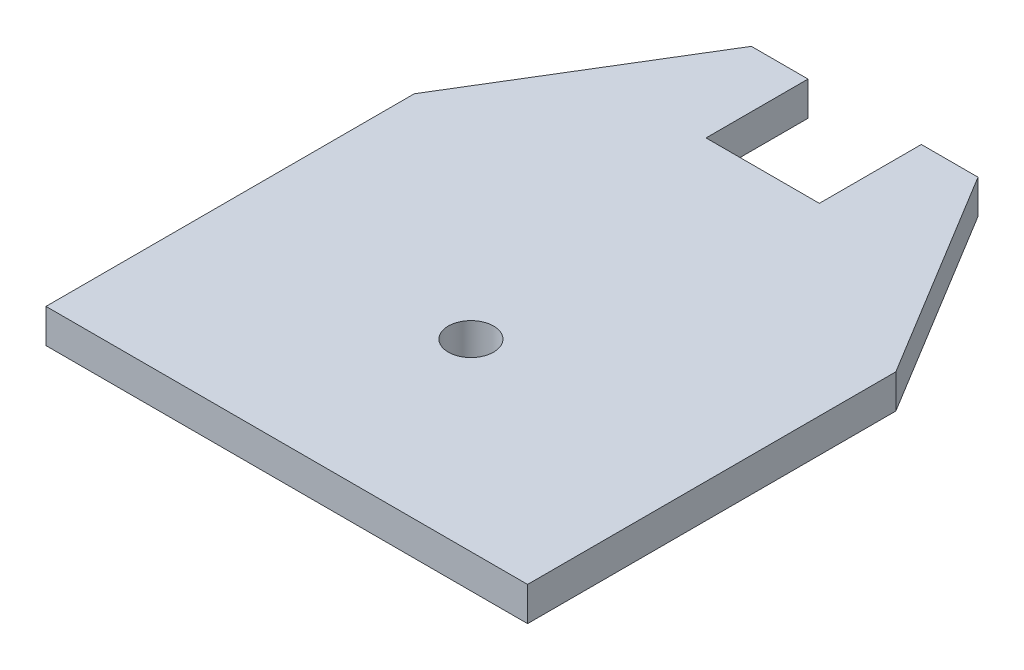
ISO-10303-21;
HEADER;
FILE_DESCRIPTION(('STEP AP214'),'2;1');
FILE_NAME('part.step','',(''),(''),'','','');
FILE_SCHEMA(('AUTOMOTIVE_DESIGN { 1 0 10303 214 1 1 1 1 }'));
ENDSEC;
DATA;
#1=APPLICATION_CONTEXT('core data for automotive mechanical design processes');
#2=APPLICATION_PROTOCOL_DEFINITION('international standard','automotive_design',2000,#1);
#3=PRODUCT_CONTEXT('',#1,'mechanical');
#4=PRODUCT('Part','Part','',(#3));
#5=PRODUCT_RELATED_PRODUCT_CATEGORY('part','',(#4));
#6=PRODUCT_DEFINITION_FORMATION('','',#4);
#7=PRODUCT_DEFINITION_CONTEXT('part definition',#1,'design');
#8=PRODUCT_DEFINITION('design','',#6,#7);
#9=PRODUCT_DEFINITION_SHAPE('','',#8);
#10=(LENGTH_UNIT() NAMED_UNIT(*) SI_UNIT(.MILLI.,.METRE.));
#11=(NAMED_UNIT(*) PLANE_ANGLE_UNIT() SI_UNIT($,.RADIAN.));
#12=(NAMED_UNIT(*) SI_UNIT($,.STERADIAN.) SOLID_ANGLE_UNIT());
#13=UNCERTAINTY_MEASURE_WITH_UNIT(LENGTH_MEASURE(1.E-05),#10,'distance_accuracy_value','');
#14=(GEOMETRIC_REPRESENTATION_CONTEXT(3) GLOBAL_UNCERTAINTY_ASSIGNED_CONTEXT((#13)) GLOBAL_UNIT_ASSIGNED_CONTEXT((#10,
#11,#12)) REPRESENTATION_CONTEXT('',''));
#15=CARTESIAN_POINT('',(0.,0.,0.));
#16=DIRECTION('',(0.,0.,1.));
#17=DIRECTION('',(1.,0.,0.));
#18=AXIS2_PLACEMENT_3D('',#15,#16,#17);
#19=CARTESIAN_POINT('',(-42.5,6.,-40.6650106175409));
#20=DIRECTION('',(0.,0.,1.));
#21=DIRECTION('',(1.,0.,0.));
#22=AXIS2_PLACEMENT_3D('',#19,#20,#21);
#23=PLANE('',#22);
#24=DIRECTION('',(-1.,0.,0.));
#25=VECTOR('',#24,1.);
#26=CARTESIAN_POINT('',(-42.5,0.,-40.6650106175409));
#27=LINE('',#26,#25);
#28=CARTESIAN_POINT('',(20.,0.,-40.6650106175408));
#29=VERTEX_POINT('',#28);
#30=CARTESIAN_POINT('',(10.0000000321542,0.,-40.6650106175421));
#31=VERTEX_POINT('',#30);
#32=EDGE_CURVE('E127',#29,#31,#27,.T.);
#33=ORIENTED_EDGE('',*,*,#32,.T.);
#34=DIRECTION('',(0.,1.,0.));
#35=VECTOR('',#34,1.);
#36=CARTESIAN_POINT('',(10.0000000321542,0.,-40.6650106175421));
#37=LINE('',#36,#35);
#38=CARTESIAN_POINT('',(10.0000000321542,6.,-40.6650106175421));
#39=VERTEX_POINT('',#38);
#40=EDGE_CURVE('E111',#31,#39,#37,.T.);
#41=ORIENTED_EDGE('',*,*,#40,.T.);
#42=DIRECTION('',(-1.,0.,0.));
#43=VECTOR('',#42,1.);
#44=CARTESIAN_POINT('',(-42.5,6.,-40.6650106175409));
#45=LINE('',#44,#43);
#46=CARTESIAN_POINT('',(20.,6.,-40.6650106175408));
#47=VERTEX_POINT('',#46);
#48=EDGE_CURVE('E154',#47,#39,#45,.T.);
#49=ORIENTED_EDGE('',*,*,#48,.F.);
#50=DIRECTION('',(0.,1.,0.));
#51=VECTOR('',#50,1.);
#52=CARTESIAN_POINT('',(20.,0.,-40.6650106175408));
#53=LINE('',#52,#51);
#54=EDGE_CURVE('E133',#29,#47,#53,.T.);
#55=ORIENTED_EDGE('',*,*,#54,.F.);
#56=EDGE_LOOP('',(#33,#41,#49,#55));
#57=FACE_BOUND('',#56,.T.);
#58=ADVANCED_FACE('F32',(#57),#23,.F.);
#59=CARTESIAN_POINT('',(42.5,6.,-40.6650106175409));
#60=DIRECTION('',(-1.,0.,0.));
#61=DIRECTION('',(0.,0.,1.));
#62=AXIS2_PLACEMENT_3D('',#59,#60,#61);
#63=PLANE('',#62);
#64=DIRECTION('',(0.,0.,-1.));
#65=VECTOR('',#64,1.);
#66=CARTESIAN_POINT('',(42.5,0.,-40.6650106175409));
#67=LINE('',#66,#65);
#68=CARTESIAN_POINT('',(42.5,0.,61.3349893824591));
#69=VERTEX_POINT('',#68);
#70=CARTESIAN_POINT('',(42.5,0.,-3.66501061754101));
#71=VERTEX_POINT('',#70);
#72=EDGE_CURVE('E138',#69,#71,#67,.T.);
#73=ORIENTED_EDGE('',*,*,#72,.T.);
#74=DIRECTION('',(0.,1.,0.));
#75=VECTOR('',#74,1.);
#76=CARTESIAN_POINT('',(42.5,0.,-3.66501061754093));
#77=LINE('',#76,#75);
#78=CARTESIAN_POINT('',(42.5,6.,-3.66501061754093));
#79=VERTEX_POINT('',#78);
#80=EDGE_CURVE('E161',#71,#79,#77,.T.);
#81=ORIENTED_EDGE('',*,*,#80,.T.);
#82=DIRECTION('',(0.,0.,-1.));
#83=VECTOR('',#82,1.);
#84=CARTESIAN_POINT('',(42.5,6.,-40.6650106175409));
#85=LINE('',#84,#83);
#86=CARTESIAN_POINT('',(42.5,6.,61.3349893824591));
#87=VERTEX_POINT('',#86);
#88=EDGE_CURVE('E142',#87,#79,#85,.T.);
#89=ORIENTED_EDGE('',*,*,#88,.F.);
#90=DIRECTION('',(0.,-1.,0.));
#91=VECTOR('',#90,1.);
#92=CARTESIAN_POINT('',(42.5,6.,61.3349893824591));
#93=LINE('',#92,#91);
#94=EDGE_CURVE('E40',#87,#69,#93,.T.);
#95=ORIENTED_EDGE('',*,*,#94,.T.);
#96=EDGE_LOOP('',(#73,#81,#89,#95));
#97=FACE_BOUND('',#96,.T.);
#98=ADVANCED_FACE('F34',(#97),#63,.F.);
#99=CARTESIAN_POINT('',(-9.99999996825875,6.,-40.6650106175421));
#100=VERTEX_POINT('',#99);
#101=CARTESIAN_POINT('',(-20.,6.,-40.6650106175408));
#102=VERTEX_POINT('',#101);
#103=EDGE_CURVE('E158',#100,#102,#45,.T.);
#104=ORIENTED_EDGE('',*,*,#103,.F.);
#105=DIRECTION('',(0.,1.,0.));
#106=VECTOR('',#105,1.);
#107=CARTESIAN_POINT('',(-9.99999996825875,0.,-40.6650106175421));
#108=LINE('',#107,#106);
#109=CARTESIAN_POINT('',(-9.99999996825875,0.,-40.6650106175421));
#110=VERTEX_POINT('',#109);
#111=EDGE_CURVE('E121',#110,#100,#108,.T.);
#112=ORIENTED_EDGE('',*,*,#111,.F.);
#113=CARTESIAN_POINT('',(-19.9999999999999,0.,-40.6650106175409));
#114=VERTEX_POINT('',#113);
#115=EDGE_CURVE('E55',#110,#114,#27,.T.);
#116=ORIENTED_EDGE('',*,*,#115,.T.);
#117=DIRECTION('',(0.,1.,0.));
#118=VECTOR('',#117,1.);
#119=CARTESIAN_POINT('',(-20.,0.,-40.6650106175408));
#120=LINE('',#119,#118);
#121=EDGE_CURVE('E167',#114,#102,#120,.T.);
#122=ORIENTED_EDGE('',*,*,#121,.T.);
#123=EDGE_LOOP('',(#104,#112,#116,#122));
#124=FACE_BOUND('',#123,.T.);
#125=ADVANCED_FACE('F200',(#124),#23,.F.);
#126=CARTESIAN_POINT('',(-42.5,6.,-40.6650106175409));
#127=DIRECTION('',(1.,0.,0.));
#128=DIRECTION('',(0.,0.,-1.));
#129=AXIS2_PLACEMENT_3D('',#126,#127,#128);
#130=PLANE('',#129);
#131=DIRECTION('',(0.,0.,1.));
#132=VECTOR('',#131,1.);
#133=CARTESIAN_POINT('',(-42.5,6.,-40.6650106175409));
#134=LINE('',#133,#132);
#135=CARTESIAN_POINT('',(-42.5,6.,-3.66501061754107));
#136=VERTEX_POINT('',#135);
#137=CARTESIAN_POINT('',(-42.5,6.,61.3349893824591));
#138=VERTEX_POINT('',#137);
#139=EDGE_CURVE('E150',#136,#138,#134,.T.);
#140=ORIENTED_EDGE('',*,*,#139,.F.);
#141=DIRECTION('',(0.,1.,0.));
#142=VECTOR('',#141,1.);
#143=CARTESIAN_POINT('',(-42.5,0.,-3.66501061754107));
#144=LINE('',#143,#142);
#145=CARTESIAN_POINT('',(-42.5,0.,-3.66501061754107));
#146=VERTEX_POINT('',#145);
#147=EDGE_CURVE('E169',#146,#136,#144,.T.);
#148=ORIENTED_EDGE('',*,*,#147,.F.);
#149=DIRECTION('',(0.,0.,1.));
#150=VECTOR('',#149,1.);
#151=CARTESIAN_POINT('',(-42.5,0.,-40.6650106175409));
#152=LINE('',#151,#150);
#153=CARTESIAN_POINT('',(-42.5,0.,61.3349893824591));
#154=VERTEX_POINT('',#153);
#155=EDGE_CURVE('E134',#146,#154,#152,.T.);
#156=ORIENTED_EDGE('',*,*,#155,.T.);
#157=DIRECTION('',(0.,-1.,0.));
#158=VECTOR('',#157,1.);
#159=CARTESIAN_POINT('',(-42.5,6.,61.3349893824591));
#160=LINE('',#159,#158);
#161=EDGE_CURVE('E11',#138,#154,#160,.T.);
#162=ORIENTED_EDGE('',*,*,#161,.F.);
#163=EDGE_LOOP('',(#140,#148,#156,#162));
#164=FACE_BOUND('',#163,.T.);
#165=ADVANCED_FACE('F211',(#164),#130,.F.);
#166=CARTESIAN_POINT('',(-42.5,6.,61.3349893824591));
#167=DIRECTION('',(0.,0.,-1.));
#168=DIRECTION('',(-1.,0.,0.));
#169=AXIS2_PLACEMENT_3D('',#166,#167,#168);
#170=PLANE('',#169);
#171=DIRECTION('',(1.,0.,0.));
#172=VECTOR('',#171,1.);
#173=CARTESIAN_POINT('',(-42.5,0.,61.3349893824591));
#174=LINE('',#173,#172);
#175=EDGE_CURVE('E136',#154,#69,#174,.T.);
#176=ORIENTED_EDGE('',*,*,#175,.T.);
#177=ORIENTED_EDGE('',*,*,#94,.F.);
#178=DIRECTION('',(1.,0.,0.));
#179=VECTOR('',#178,1.);
#180=CARTESIAN_POINT('',(-42.5,6.,61.3349893824591));
#181=LINE('',#180,#179);
#182=EDGE_CURVE('E144',#138,#87,#181,.T.);
#183=ORIENTED_EDGE('',*,*,#182,.F.);
#184=ORIENTED_EDGE('',*,*,#161,.T.);
#185=EDGE_LOOP('',(#176,#177,#183,#184));
#186=FACE_BOUND('',#185,.T.);
#187=ADVANCED_FACE('F215',(#186),#170,.F.);
#188=CARTESIAN_POINT('',(42.5,6.,61.3349893824591));
#189=DIRECTION('',(0.,1.,0.));
#190=DIRECTION('',(0.,0.,1.));
#191=AXIS2_PLACEMENT_3D('',#188,#189,#190);
#192=PLANE('',#191);
#193=DIRECTION('',(0.,0.,-1.));
#194=VECTOR('',#193,1.);
#195=CARTESIAN_POINT('',(10.0000000321542,6.,-22.6650106175421));
#196=LINE('',#195,#194);
#197=CARTESIAN_POINT('',(10.0000000321542,6.,-22.6650106175421));
#198=VERTEX_POINT('',#197);
#199=EDGE_CURVE('E116',#198,#39,#196,.T.);
#200=ORIENTED_EDGE('',*,*,#199,.F.);
#201=DIRECTION('',(1.,0.,0.));
#202=VECTOR('',#201,1.);
#203=CARTESIAN_POINT('',(10.0000000321542,6.,-22.6650106175421));
#204=LINE('',#203,#202);
#205=CARTESIAN_POINT('',(-9.99999996825875,6.,-22.6650106175421));
#206=VERTEX_POINT('',#205);
#207=EDGE_CURVE('E130',#206,#198,#204,.T.);
#208=ORIENTED_EDGE('',*,*,#207,.F.);
#209=DIRECTION('',(0.,0.,1.));
#210=VECTOR('',#209,1.);
#211=CARTESIAN_POINT('',(-9.99999996825875,6.,-22.6650106175421));
#212=LINE('',#211,#210);
#213=EDGE_CURVE('E191',#100,#206,#212,.T.);
#214=ORIENTED_EDGE('',*,*,#213,.F.);
#215=ORIENTED_EDGE('',*,*,#103,.T.);
#216=DIRECTION('',(0.519580604718231,0.,-0.854421438869974));
#217=VECTOR('',#216,1.);
#218=CARTESIAN_POINT('',(-42.5,6.,-3.66501061754107));
#219=LINE('',#218,#217);
#220=EDGE_CURVE('E173',#136,#102,#219,.T.);
#221=ORIENTED_EDGE('',*,*,#220,.F.);
#222=ORIENTED_EDGE('',*,*,#139,.T.);
#223=ORIENTED_EDGE('',*,*,#182,.T.);
#224=ORIENTED_EDGE('',*,*,#88,.T.);
#225=DIRECTION('',(0.519580604718229,0.,0.854421438869975));
#226=VECTOR('',#225,1.);
#227=CARTESIAN_POINT('',(42.5,6.,-3.66501061754093));
#228=LINE('',#227,#226);
#229=EDGE_CURVE('E165',#47,#79,#228,.T.);
#230=ORIENTED_EDGE('',*,*,#229,.F.);
#231=ORIENTED_EDGE('',*,*,#48,.T.);
#232=EDGE_LOOP('',(#200,#208,#214,#215,#221,#222,#223,#224,#230,#231));
#233=FACE_BOUND('',#232,.T.);
#234=CARTESIAN_POINT('',(0.,6.,28.8349893824591));
#235=DIRECTION('',(0.,1.,0.));
#236=DIRECTION('',(0.,0.,1.));
#237=AXIS2_PLACEMENT_3D('',#234,#235,#236);
#238=CIRCLE('',#237,4.);
#239=CARTESIAN_POINT('',(0.,6.,32.8349893824591));
#240=VERTEX_POINT('',#239);
#241=EDGE_CURVE('E179',#240,#240,#238,.T.);
#242=ORIENTED_EDGE('',*,*,#241,.F.);
#243=EDGE_LOOP('',(#242));
#244=FACE_BOUND('',#243,.T.);
#245=ADVANCED_FACE('F202',(#233,#244),#192,.T.);
#246=CARTESIAN_POINT('',(42.5,0.,61.3349893824591));
#247=DIRECTION('',(0.,1.,0.));
#248=DIRECTION('',(0.,0.,1.));
#249=AXIS2_PLACEMENT_3D('',#246,#247,#248);
#250=PLANE('',#249);
#251=CARTESIAN_POINT('',(0.,0.,28.8349893824591));
#252=DIRECTION('',(0.,1.,0.));
#253=DIRECTION('',(0.,0.,1.));
#254=AXIS2_PLACEMENT_3D('',#251,#252,#253);
#255=CIRCLE('',#254,4.);
#256=CARTESIAN_POINT('',(0.,0.,32.8349893824591));
#257=VERTEX_POINT('',#256);
#258=EDGE_CURVE('E176',#257,#257,#255,.T.);
#259=ORIENTED_EDGE('',*,*,#258,.T.);
#260=EDGE_LOOP('',(#259));
#261=FACE_BOUND('',#260,.T.);
#262=DIRECTION('',(1.,0.,0.));
#263=VECTOR('',#262,1.);
#264=CARTESIAN_POINT('',(10.0000000321542,0.,-22.6650106175421));
#265=LINE('',#264,#263);
#266=CARTESIAN_POINT('',(-9.99999996825875,0.,-22.6650106175421));
#267=VERTEX_POINT('',#266);
#268=CARTESIAN_POINT('',(10.0000000321542,0.,-22.6650106175421));
#269=VERTEX_POINT('',#268);
#270=EDGE_CURVE('E47',#267,#269,#265,.T.);
#271=ORIENTED_EDGE('',*,*,#270,.T.);
#272=DIRECTION('',(0.,0.,-1.));
#273=VECTOR('',#272,1.);
#274=CARTESIAN_POINT('',(10.0000000321542,0.,-22.6650106175421));
#275=LINE('',#274,#273);
#276=EDGE_CURVE('E114',#269,#31,#275,.T.);
#277=ORIENTED_EDGE('',*,*,#276,.T.);
#278=ORIENTED_EDGE('',*,*,#32,.F.);
#279=DIRECTION('',(0.519580604718229,0.,0.854421438869975));
#280=VECTOR('',#279,1.);
#281=CARTESIAN_POINT('',(42.5,0.,-3.66501061754093));
#282=LINE('',#281,#280);
#283=EDGE_CURVE('E162',#29,#71,#282,.T.);
#284=ORIENTED_EDGE('',*,*,#283,.T.);
#285=ORIENTED_EDGE('',*,*,#72,.F.);
#286=ORIENTED_EDGE('',*,*,#175,.F.);
#287=ORIENTED_EDGE('',*,*,#155,.F.);
#288=DIRECTION('',(0.519580604718231,0.,-0.854421438869974));
#289=VECTOR('',#288,1.);
#290=CARTESIAN_POINT('',(-42.5,0.,-3.66501061754107));
#291=LINE('',#290,#289);
#292=EDGE_CURVE('E171',#146,#114,#291,.T.);
#293=ORIENTED_EDGE('',*,*,#292,.T.);
#294=ORIENTED_EDGE('',*,*,#115,.F.);
#295=DIRECTION('',(0.,0.,1.));
#296=VECTOR('',#295,1.);
#297=CARTESIAN_POINT('',(-9.99999996825875,0.,-22.6650106175421));
#298=LINE('',#297,#296);
#299=EDGE_CURVE('E129',#110,#267,#298,.T.);
#300=ORIENTED_EDGE('',*,*,#299,.T.);
#301=EDGE_LOOP('',(#271,#277,#278,#284,#285,#286,#287,#293,#294,#300));
#302=FACE_BOUND('',#301,.T.);
#303=ADVANCED_FACE('F125',(#261,#302),#250,.F.);
#304=CARTESIAN_POINT('',(42.5,0.,-3.66501061754093));
#305=DIRECTION('',(-0.854421438869975,0.,0.519580604718229));
#306=DIRECTION('',(0.519580604718229,0.,0.854421438869975));
#307=AXIS2_PLACEMENT_3D('',#304,#305,#306);
#308=PLANE('',#307);
#309=ORIENTED_EDGE('',*,*,#229,.T.);
#310=ORIENTED_EDGE('',*,*,#80,.F.);
#311=ORIENTED_EDGE('',*,*,#283,.F.);
#312=ORIENTED_EDGE('',*,*,#54,.T.);
#313=EDGE_LOOP('',(#309,#310,#311,#312));
#314=FACE_BOUND('',#313,.T.);
#315=ADVANCED_FACE('F218',(#314),#308,.F.);
#316=CARTESIAN_POINT('',(-42.5,0.,-3.66501061754107));
#317=DIRECTION('',(0.854421438869974,0.,0.519580604718231));
#318=DIRECTION('',(0.519580604718231,0.,-0.854421438869974));
#319=AXIS2_PLACEMENT_3D('',#316,#317,#318);
#320=PLANE('',#319);
#321=ORIENTED_EDGE('',*,*,#220,.T.);
#322=ORIENTED_EDGE('',*,*,#121,.F.);
#323=ORIENTED_EDGE('',*,*,#292,.F.);
#324=ORIENTED_EDGE('',*,*,#147,.T.);
#325=EDGE_LOOP('',(#321,#322,#323,#324));
#326=FACE_BOUND('',#325,.T.);
#327=ADVANCED_FACE('F207',(#326),#320,.F.);
#328=CARTESIAN_POINT('',(0.,0.,28.8349893824591));
#329=DIRECTION('',(0.,1.,0.));
#330=DIRECTION('',(0.,0.,1.));
#331=AXIS2_PLACEMENT_3D('',#328,#329,#330);
#332=CYLINDRICAL_SURFACE('',#331,4.);
#333=ORIENTED_EDGE('',*,*,#258,.F.);
#334=EDGE_LOOP('',(#333));
#335=FACE_BOUND('',#334,.T.);
#336=ORIENTED_EDGE('',*,*,#241,.T.);
#337=EDGE_LOOP('',(#336));
#338=FACE_BOUND('',#337,.T.);
#339=ADVANCED_FACE('F225',(#335,#338),#332,.F.);
#340=CARTESIAN_POINT('',(10.0000000321542,0.,-22.6650106175421));
#341=DIRECTION('',(1.,0.,0.));
#342=DIRECTION('',(0.,0.,-1.));
#343=AXIS2_PLACEMENT_3D('',#340,#341,#342);
#344=PLANE('',#343);
#345=ORIENTED_EDGE('',*,*,#199,.T.);
#346=ORIENTED_EDGE('',*,*,#40,.F.);
#347=ORIENTED_EDGE('',*,*,#276,.F.);
#348=DIRECTION('',(0.,1.,0.));
#349=VECTOR('',#348,1.);
#350=CARTESIAN_POINT('',(10.0000000321542,0.,-22.6650106175421));
#351=LINE('',#350,#349);
#352=EDGE_CURVE('E182',#269,#198,#351,.T.);
#353=ORIENTED_EDGE('',*,*,#352,.T.);
#354=EDGE_LOOP('',(#345,#346,#347,#353));
#355=FACE_BOUND('',#354,.T.);
#356=ADVANCED_FACE('F113',(#355),#344,.F.);
#357=CARTESIAN_POINT('',(10.0000000321542,0.,-22.6650106175421));
#358=DIRECTION('',(0.,0.,1.));
#359=DIRECTION('',(1.,0.,0.));
#360=AXIS2_PLACEMENT_3D('',#357,#358,#359);
#361=PLANE('',#360);
#362=ORIENTED_EDGE('',*,*,#207,.T.);
#363=ORIENTED_EDGE('',*,*,#352,.F.);
#364=ORIENTED_EDGE('',*,*,#270,.F.);
#365=DIRECTION('',(0.,1.,0.));
#366=VECTOR('',#365,1.);
#367=CARTESIAN_POINT('',(-9.99999996825875,0.,-22.6650106175421));
#368=LINE('',#367,#366);
#369=EDGE_CURVE('E186',#267,#206,#368,.T.);
#370=ORIENTED_EDGE('',*,*,#369,.T.);
#371=EDGE_LOOP('',(#362,#363,#364,#370));
#372=FACE_BOUND('',#371,.T.);
#373=ADVANCED_FACE('F262',(#372),#361,.F.);
#374=CARTESIAN_POINT('',(-9.99999996825875,0.,-22.6650106175421));
#375=DIRECTION('',(-1.,0.,0.));
#376=DIRECTION('',(0.,0.,1.));
#377=AXIS2_PLACEMENT_3D('',#374,#375,#376);
#378=PLANE('',#377);
#379=ORIENTED_EDGE('',*,*,#213,.T.);
#380=ORIENTED_EDGE('',*,*,#369,.F.);
#381=ORIENTED_EDGE('',*,*,#299,.F.);
#382=ORIENTED_EDGE('',*,*,#111,.T.);
#383=EDGE_LOOP('',(#379,#380,#381,#382));
#384=FACE_BOUND('',#383,.T.);
#385=ADVANCED_FACE('F197',(#384),#378,.F.);
#386=CLOSED_SHELL('',(#58,#98,#125,#165,#187,#245,#303,#315,#327,#339,#356,#373,#385));
#387=MANIFOLD_SOLID_BREP('B2',#386);
#388=ADVANCED_BREP_SHAPE_REPRESENTATION('',(#18,#387),#14);
#389=SHAPE_DEFINITION_REPRESENTATION(#9,#388);
ENDSEC;
END-ISO-10303-21;
